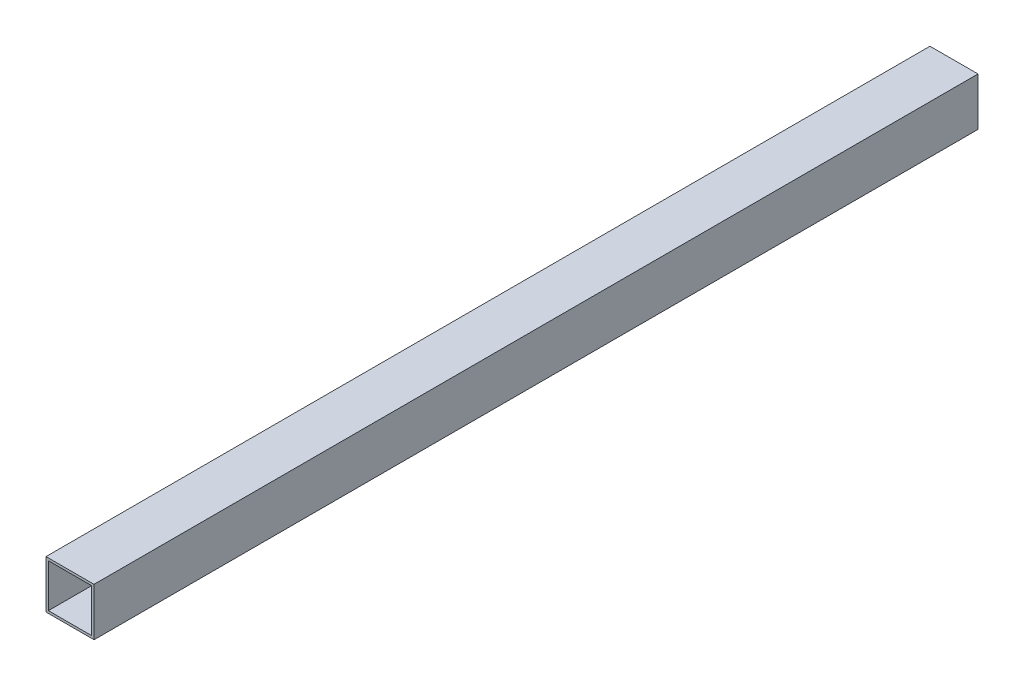
ISO-10303-21;
HEADER;
FILE_DESCRIPTION(('STEP AP214'),'2;1');
FILE_NAME('part.step','',(''),(''),'','','');
FILE_SCHEMA(('AUTOMOTIVE_DESIGN { 1 0 10303 214 1 1 1 1 }'));
ENDSEC;
DATA;
#1=APPLICATION_CONTEXT('core data for automotive mechanical design processes');
#2=APPLICATION_PROTOCOL_DEFINITION('international standard','automotive_design',2000,#1);
#3=PRODUCT_CONTEXT('',#1,'mechanical');
#4=PRODUCT('Part','Part','',(#3));
#5=PRODUCT_RELATED_PRODUCT_CATEGORY('part','',(#4));
#6=PRODUCT_DEFINITION_FORMATION('','',#4);
#7=PRODUCT_DEFINITION_CONTEXT('part definition',#1,'design');
#8=PRODUCT_DEFINITION('design','',#6,#7);
#9=PRODUCT_DEFINITION_SHAPE('','',#8);
#10=(LENGTH_UNIT() NAMED_UNIT(*) SI_UNIT(.MILLI.,.METRE.));
#11=(NAMED_UNIT(*) PLANE_ANGLE_UNIT() SI_UNIT($,.RADIAN.));
#12=(NAMED_UNIT(*) SI_UNIT($,.STERADIAN.) SOLID_ANGLE_UNIT());
#13=UNCERTAINTY_MEASURE_WITH_UNIT(LENGTH_MEASURE(1.E-05),#10,'distance_accuracy_value','');
#14=(GEOMETRIC_REPRESENTATION_CONTEXT(3) GLOBAL_UNCERTAINTY_ASSIGNED_CONTEXT((#13)) GLOBAL_UNIT_ASSIGNED_CONTEXT((#10,
#11,#12)) REPRESENTATION_CONTEXT('',''));
#15=CARTESIAN_POINT('',(0.,0.,0.));
#16=DIRECTION('',(0.,0.,1.));
#17=DIRECTION('',(1.,0.,0.));
#18=AXIS2_PLACEMENT_3D('',#15,#16,#17);
#19=CARTESIAN_POINT('',(0.,0.,920.));
#20=DIRECTION('',(0.,0.,-1.));
#21=DIRECTION('',(-1.,0.,0.));
#22=AXIS2_PLACEMENT_3D('',#19,#20,#21);
#23=PLANE('',#22);
#24=DIRECTION('',(0.,-1.,0.));
#25=VECTOR('',#24,1.);
#26=CARTESIAN_POINT('',(-50.,-50.,920.));
#27=LINE('',#26,#25);
#28=CARTESIAN_POINT('',(-50.,49.9999999999999,920.));
#29=VERTEX_POINT('',#28);
#30=CARTESIAN_POINT('',(-50.,-50.,920.));
#31=VERTEX_POINT('',#30);
#32=EDGE_CURVE('E133',#29,#31,#27,.T.);
#33=ORIENTED_EDGE('',*,*,#32,.T.);
#34=DIRECTION('',(1.,0.,0.));
#35=VECTOR('',#34,1.);
#36=CARTESIAN_POINT('',(-50.,-50.,920.));
#37=LINE('',#36,#35);
#38=CARTESIAN_POINT('',(50.,-50.,920.));
#39=VERTEX_POINT('',#38);
#40=EDGE_CURVE('E136',#31,#39,#37,.T.);
#41=ORIENTED_EDGE('',*,*,#40,.T.);
#42=DIRECTION('',(0.,1.,0.));
#43=VECTOR('',#42,1.);
#44=CARTESIAN_POINT('',(50.,-50.,920.));
#45=LINE('',#44,#43);
#46=CARTESIAN_POINT('',(49.9999999999999,49.9999999999999,920.));
#47=VERTEX_POINT('',#46);
#48=EDGE_CURVE('E139',#39,#47,#45,.T.);
#49=ORIENTED_EDGE('',*,*,#48,.T.);
#50=DIRECTION('',(-1.,0.,0.));
#51=VECTOR('',#50,1.);
#52=CARTESIAN_POINT('',(-50.,49.9999999999999,920.));
#53=LINE('',#52,#51);
#54=EDGE_CURVE('E141',#47,#29,#53,.T.);
#55=ORIENTED_EDGE('',*,*,#54,.T.);
#56=EDGE_LOOP('',(#33,#41,#49,#55));
#57=FACE_BOUND('',#56,.T.);
#58=DIRECTION('',(0.,-1.,0.));
#59=VECTOR('',#58,1.);
#60=CARTESIAN_POINT('',(-45.,-45.,920.));
#61=LINE('',#60,#59);
#62=CARTESIAN_POINT('',(-45.,44.9999999999999,920.));
#63=VERTEX_POINT('',#62);
#64=CARTESIAN_POINT('',(-45.,-45.,920.));
#65=VERTEX_POINT('',#64);
#66=EDGE_CURVE('E97',#63,#65,#61,.T.);
#67=ORIENTED_EDGE('',*,*,#66,.F.);
#68=DIRECTION('',(-1.,0.,0.));
#69=VECTOR('',#68,1.);
#70=CARTESIAN_POINT('',(-45.,44.9999999999999,920.));
#71=LINE('',#70,#69);
#72=CARTESIAN_POINT('',(45.,44.9999999999999,920.));
#73=VERTEX_POINT('',#72);
#74=EDGE_CURVE('E119',#73,#63,#71,.T.);
#75=ORIENTED_EDGE('',*,*,#74,.F.);
#76=DIRECTION('',(0.,1.,0.));
#77=VECTOR('',#76,1.);
#78=CARTESIAN_POINT('',(45.,-45.,920.));
#79=LINE('',#78,#77);
#80=CARTESIAN_POINT('',(45.,-45.,920.));
#81=VERTEX_POINT('',#80);
#82=EDGE_CURVE('E117',#81,#73,#79,.T.);
#83=ORIENTED_EDGE('',*,*,#82,.F.);
#84=DIRECTION('',(1.,0.,0.));
#85=VECTOR('',#84,1.);
#86=CARTESIAN_POINT('',(-45.,-45.,920.));
#87=LINE('',#86,#85);
#88=EDGE_CURVE('E105',#65,#81,#87,.T.);
#89=ORIENTED_EDGE('',*,*,#88,.F.);
#90=EDGE_LOOP('',(#67,#75,#83,#89));
#91=FACE_BOUND('',#90,.T.);
#92=ADVANCED_FACE('F32',(#57,#91),#23,.F.);
#93=CARTESIAN_POINT('',(0.,0.,-920.));
#94=DIRECTION('',(0.,0.,-1.));
#95=DIRECTION('',(-1.,0.,0.));
#96=AXIS2_PLACEMENT_3D('',#93,#94,#95);
#97=PLANE('',#96);
#98=DIRECTION('',(0.,-1.,0.));
#99=VECTOR('',#98,1.);
#100=CARTESIAN_POINT('',(-50.,-50.,-920.));
#101=LINE('',#100,#99);
#102=CARTESIAN_POINT('',(-50.,49.9999999999999,-920.));
#103=VERTEX_POINT('',#102);
#104=CARTESIAN_POINT('',(-50.,-50.,-920.));
#105=VERTEX_POINT('',#104);
#106=EDGE_CURVE('E113',#103,#105,#101,.T.);
#107=ORIENTED_EDGE('',*,*,#106,.F.);
#108=DIRECTION('',(-1.,0.,0.));
#109=VECTOR('',#108,1.);
#110=CARTESIAN_POINT('',(-50.,49.9999999999999,-920.));
#111=LINE('',#110,#109);
#112=CARTESIAN_POINT('',(49.9999999999999,49.9999999999999,-920.));
#113=VERTEX_POINT('',#112);
#114=EDGE_CURVE('E137',#113,#103,#111,.T.);
#115=ORIENTED_EDGE('',*,*,#114,.F.);
#116=DIRECTION('',(0.,1.,0.));
#117=VECTOR('',#116,1.);
#118=CARTESIAN_POINT('',(50.,-50.,-920.));
#119=LINE('',#118,#117);
#120=CARTESIAN_POINT('',(50.,-50.,-920.));
#121=VERTEX_POINT('',#120);
#122=EDGE_CURVE('E148',#121,#113,#119,.T.);
#123=ORIENTED_EDGE('',*,*,#122,.F.);
#124=DIRECTION('',(1.,0.,0.));
#125=VECTOR('',#124,1.);
#126=CARTESIAN_POINT('',(-50.,-50.,-920.));
#127=LINE('',#126,#125);
#128=EDGE_CURVE('E146',#105,#121,#127,.T.);
#129=ORIENTED_EDGE('',*,*,#128,.F.);
#130=EDGE_LOOP('',(#107,#115,#123,#129));
#131=FACE_BOUND('',#130,.T.);
#132=DIRECTION('',(-1.,0.,0.));
#133=VECTOR('',#132,1.);
#134=CARTESIAN_POINT('',(-45.,44.9999999999999,-920.));
#135=LINE('',#134,#133);
#136=CARTESIAN_POINT('',(45.,44.9999999999999,-920.));
#137=VERTEX_POINT('',#136);
#138=CARTESIAN_POINT('',(-45.,44.9999999999999,-920.));
#139=VERTEX_POINT('',#138);
#140=EDGE_CURVE('E106',#137,#139,#135,.T.);
#141=ORIENTED_EDGE('',*,*,#140,.T.);
#142=DIRECTION('',(0.,-1.,0.));
#143=VECTOR('',#142,1.);
#144=CARTESIAN_POINT('',(-45.,-45.,-920.));
#145=LINE('',#144,#143);
#146=CARTESIAN_POINT('',(-45.,-45.,-920.));
#147=VERTEX_POINT('',#146);
#148=EDGE_CURVE('E55',#139,#147,#145,.T.);
#149=ORIENTED_EDGE('',*,*,#148,.T.);
#150=DIRECTION('',(1.,0.,0.));
#151=VECTOR('',#150,1.);
#152=CARTESIAN_POINT('',(-45.,-45.,-920.));
#153=LINE('',#152,#151);
#154=CARTESIAN_POINT('',(45.,-45.,-920.));
#155=VERTEX_POINT('',#154);
#156=EDGE_CURVE('E112',#147,#155,#153,.T.);
#157=ORIENTED_EDGE('',*,*,#156,.T.);
#158=DIRECTION('',(0.,1.,0.));
#159=VECTOR('',#158,1.);
#160=CARTESIAN_POINT('',(45.,-45.,-920.));
#161=LINE('',#160,#159);
#162=EDGE_CURVE('E125',#155,#137,#161,.T.);
#163=ORIENTED_EDGE('',*,*,#162,.T.);
#164=EDGE_LOOP('',(#141,#149,#157,#163));
#165=FACE_BOUND('',#164,.T.);
#166=ADVANCED_FACE('F166',(#131,#165),#97,.T.);
#167=CARTESIAN_POINT('',(-50.,-50.,920.));
#168=DIRECTION('',(1.,0.,0.));
#169=DIRECTION('',(0.,0.,-1.));
#170=AXIS2_PLACEMENT_3D('',#167,#168,#169);
#171=PLANE('',#170);
#172=ORIENTED_EDGE('',*,*,#106,.T.);
#173=DIRECTION('',(0.,0.,-1.));
#174=VECTOR('',#173,1.);
#175=CARTESIAN_POINT('',(-50.,-50.,920.));
#176=LINE('',#175,#174);
#177=EDGE_CURVE('E11',#31,#105,#176,.T.);
#178=ORIENTED_EDGE('',*,*,#177,.F.);
#179=ORIENTED_EDGE('',*,*,#32,.F.);
#180=DIRECTION('',(0.,0.,-1.));
#181=VECTOR('',#180,1.);
#182=CARTESIAN_POINT('',(-50.,49.9999999999999,920.));
#183=LINE('',#182,#181);
#184=EDGE_CURVE('E143',#29,#103,#183,.T.);
#185=ORIENTED_EDGE('',*,*,#184,.T.);
#186=EDGE_LOOP('',(#172,#178,#179,#185));
#187=FACE_BOUND('',#186,.T.);
#188=ADVANCED_FACE('F34',(#187),#171,.F.);
#189=CARTESIAN_POINT('',(-50.,-50.,920.));
#190=DIRECTION('',(0.,1.,0.));
#191=DIRECTION('',(0.,0.,1.));
#192=AXIS2_PLACEMENT_3D('',#189,#190,#191);
#193=PLANE('',#192);
#194=ORIENTED_EDGE('',*,*,#128,.T.);
#195=DIRECTION('',(0.,0.,-1.));
#196=VECTOR('',#195,1.);
#197=CARTESIAN_POINT('',(50.,-50.,920.));
#198=LINE('',#197,#196);
#199=EDGE_CURVE('E40',#39,#121,#198,.T.);
#200=ORIENTED_EDGE('',*,*,#199,.F.);
#201=ORIENTED_EDGE('',*,*,#40,.F.);
#202=ORIENTED_EDGE('',*,*,#177,.T.);
#203=EDGE_LOOP('',(#194,#200,#201,#202));
#204=FACE_BOUND('',#203,.T.);
#205=ADVANCED_FACE('F176',(#204),#193,.F.);
#206=CARTESIAN_POINT('',(50.,-50.,920.));
#207=DIRECTION('',(-1.,0.,0.));
#208=DIRECTION('',(0.,-1.,0.));
#209=AXIS2_PLACEMENT_3D('',#206,#207,#208);
#210=PLANE('',#209);
#211=ORIENTED_EDGE('',*,*,#122,.T.);
#212=DIRECTION('',(0.,0.,-1.));
#213=VECTOR('',#212,1.);
#214=CARTESIAN_POINT('',(49.9999999999999,49.9999999999999,920.));
#215=LINE('',#214,#213);
#216=EDGE_CURVE('E153',#47,#113,#215,.T.);
#217=ORIENTED_EDGE('',*,*,#216,.F.);
#218=ORIENTED_EDGE('',*,*,#48,.F.);
#219=ORIENTED_EDGE('',*,*,#199,.T.);
#220=EDGE_LOOP('',(#211,#217,#218,#219));
#221=FACE_BOUND('',#220,.T.);
#222=ADVANCED_FACE('F160',(#221),#210,.F.);
#223=CARTESIAN_POINT('',(-50.,49.9999999999999,920.));
#224=DIRECTION('',(0.,-1.,0.));
#225=DIRECTION('',(0.,0.,-1.));
#226=AXIS2_PLACEMENT_3D('',#223,#224,#225);
#227=PLANE('',#226);
#228=ORIENTED_EDGE('',*,*,#114,.T.);
#229=ORIENTED_EDGE('',*,*,#184,.F.);
#230=ORIENTED_EDGE('',*,*,#54,.F.);
#231=ORIENTED_EDGE('',*,*,#216,.T.);
#232=EDGE_LOOP('',(#228,#229,#230,#231));
#233=FACE_BOUND('',#232,.T.);
#234=ADVANCED_FACE('F170',(#233),#227,.F.);
#235=CARTESIAN_POINT('',(-45.,-45.,920.));
#236=DIRECTION('',(1.,0.,0.));
#237=DIRECTION('',(0.,0.,-1.));
#238=AXIS2_PLACEMENT_3D('',#235,#236,#237);
#239=PLANE('',#238);
#240=ORIENTED_EDGE('',*,*,#148,.F.);
#241=DIRECTION('',(0.,0.,-1.));
#242=VECTOR('',#241,1.);
#243=CARTESIAN_POINT('',(-45.,44.9999999999999,920.));
#244=LINE('',#243,#242);
#245=EDGE_CURVE('E101',#63,#139,#244,.T.);
#246=ORIENTED_EDGE('',*,*,#245,.F.);
#247=ORIENTED_EDGE('',*,*,#66,.T.);
#248=DIRECTION('',(0.,0.,-1.));
#249=VECTOR('',#248,1.);
#250=CARTESIAN_POINT('',(-45.,-45.,920.));
#251=LINE('',#250,#249);
#252=EDGE_CURVE('E100',#65,#147,#251,.T.);
#253=ORIENTED_EDGE('',*,*,#252,.T.);
#254=EDGE_LOOP('',(#240,#246,#247,#253));
#255=FACE_BOUND('',#254,.T.);
#256=ADVANCED_FACE('F99',(#255),#239,.T.);
#257=CARTESIAN_POINT('',(-45.,-45.,920.));
#258=DIRECTION('',(0.,1.,0.));
#259=DIRECTION('',(0.,0.,1.));
#260=AXIS2_PLACEMENT_3D('',#257,#258,#259);
#261=PLANE('',#260);
#262=ORIENTED_EDGE('',*,*,#156,.F.);
#263=ORIENTED_EDGE('',*,*,#252,.F.);
#264=ORIENTED_EDGE('',*,*,#88,.T.);
#265=DIRECTION('',(0.,0.,-1.));
#266=VECTOR('',#265,1.);
#267=CARTESIAN_POINT('',(45.,-45.,920.));
#268=LINE('',#267,#266);
#269=EDGE_CURVE('E114',#81,#155,#268,.T.);
#270=ORIENTED_EDGE('',*,*,#269,.T.);
#271=EDGE_LOOP('',(#262,#263,#264,#270));
#272=FACE_BOUND('',#271,.T.);
#273=ADVANCED_FACE('F109',(#272),#261,.T.);
#274=CARTESIAN_POINT('',(45.,-45.,920.));
#275=DIRECTION('',(-1.,0.,0.));
#276=DIRECTION('',(0.,-1.,0.));
#277=AXIS2_PLACEMENT_3D('',#274,#275,#276);
#278=PLANE('',#277);
#279=ORIENTED_EDGE('',*,*,#162,.F.);
#280=ORIENTED_EDGE('',*,*,#269,.F.);
#281=ORIENTED_EDGE('',*,*,#82,.T.);
#282=DIRECTION('',(0.,0.,-1.));
#283=VECTOR('',#282,1.);
#284=CARTESIAN_POINT('',(45.,44.9999999999999,920.));
#285=LINE('',#284,#283);
#286=EDGE_CURVE('E47',#73,#137,#285,.T.);
#287=ORIENTED_EDGE('',*,*,#286,.T.);
#288=EDGE_LOOP('',(#279,#280,#281,#287));
#289=FACE_BOUND('',#288,.T.);
#290=ADVANCED_FACE('F199',(#289),#278,.T.);
#291=CARTESIAN_POINT('',(-45.,44.9999999999999,920.));
#292=DIRECTION('',(0.,-1.,0.));
#293=DIRECTION('',(0.,0.,-1.));
#294=AXIS2_PLACEMENT_3D('',#291,#292,#293);
#295=PLANE('',#294);
#296=ORIENTED_EDGE('',*,*,#140,.F.);
#297=ORIENTED_EDGE('',*,*,#286,.F.);
#298=ORIENTED_EDGE('',*,*,#74,.T.);
#299=ORIENTED_EDGE('',*,*,#245,.T.);
#300=EDGE_LOOP('',(#296,#297,#298,#299));
#301=FACE_BOUND('',#300,.T.);
#302=ADVANCED_FACE('F203',(#301),#295,.T.);
#303=CLOSED_SHELL('',(#92,#166,#188,#205,#222,#234,#256,#273,#290,#302));
#304=MANIFOLD_SOLID_BREP('B2',#303);
#305=ADVANCED_BREP_SHAPE_REPRESENTATION('',(#18,#304),#14);
#306=SHAPE_DEFINITION_REPRESENTATION(#9,#305);
ENDSEC;
END-ISO-10303-21;
